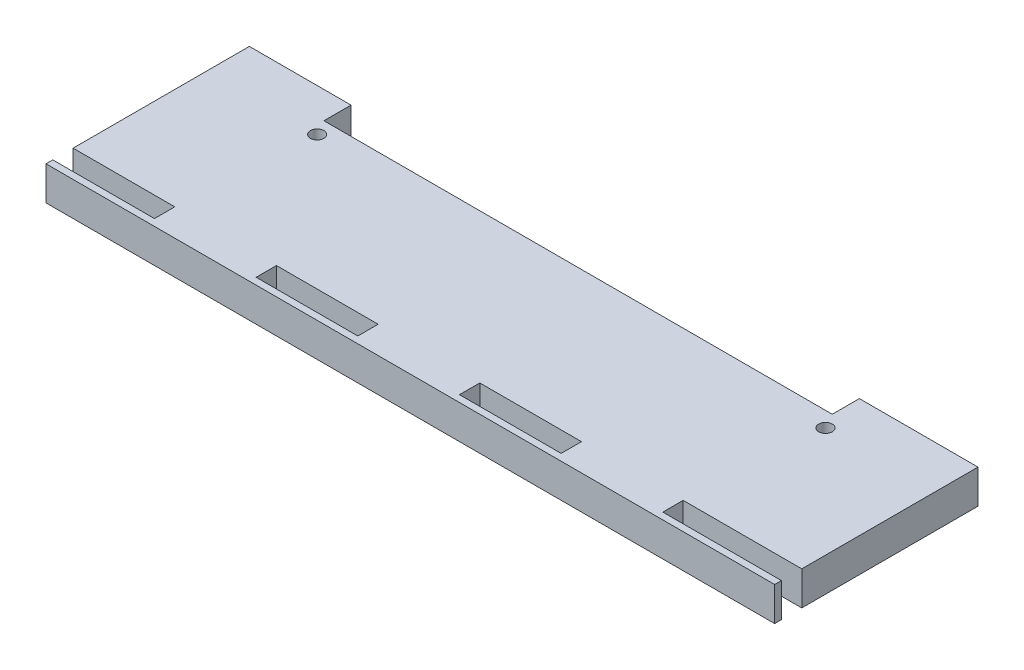
ISO-10303-21;
HEADER;
FILE_DESCRIPTION(('STEP AP214'),'2;1');
FILE_NAME('part.step','',(''),(''),'','','');
FILE_SCHEMA(('AUTOMOTIVE_DESIGN { 1 0 10303 214 1 1 1 1 }'));
ENDSEC;
DATA;
#1=APPLICATION_CONTEXT('core data for automotive mechanical design processes');
#2=APPLICATION_PROTOCOL_DEFINITION('international standard','automotive_design',2000,#1);
#3=PRODUCT_CONTEXT('',#1,'mechanical');
#4=PRODUCT('Part','Part','',(#3));
#5=PRODUCT_RELATED_PRODUCT_CATEGORY('part','',(#4));
#6=PRODUCT_DEFINITION_FORMATION('','',#4);
#7=PRODUCT_DEFINITION_CONTEXT('part definition',#1,'design');
#8=PRODUCT_DEFINITION('design','',#6,#7);
#9=PRODUCT_DEFINITION_SHAPE('','',#8);
#10=(LENGTH_UNIT() NAMED_UNIT(*) SI_UNIT(.MILLI.,.METRE.));
#11=(NAMED_UNIT(*) PLANE_ANGLE_UNIT() SI_UNIT($,.RADIAN.));
#12=(NAMED_UNIT(*) SI_UNIT($,.STERADIAN.) SOLID_ANGLE_UNIT());
#13=UNCERTAINTY_MEASURE_WITH_UNIT(LENGTH_MEASURE(1.E-05),#10,'distance_accuracy_value','');
#14=(GEOMETRIC_REPRESENTATION_CONTEXT(3) GLOBAL_UNCERTAINTY_ASSIGNED_CONTEXT((#13)) GLOBAL_UNIT_ASSIGNED_CONTEXT((#10,
#11,#12)) REPRESENTATION_CONTEXT('',''));
#15=CARTESIAN_POINT('',(0.,0.,0.));
#16=DIRECTION('',(0.,0.,1.));
#17=DIRECTION('',(1.,0.,0.));
#18=AXIS2_PLACEMENT_3D('',#15,#16,#17);
#19=CARTESIAN_POINT('',(0.,10.,33.));
#20=DIRECTION('',(0.,0.,-1.));
#21=DIRECTION('',(-1.,0.,0.));
#22=AXIS2_PLACEMENT_3D('',#19,#20,#21);
#23=PLANE('',#22);
#24=DIRECTION('',(1.,0.,0.));
#25=VECTOR('',#24,1.);
#26=CARTESIAN_POINT('',(0.,0.,33.));
#27=LINE('',#26,#25);
#28=CARTESIAN_POINT('',(72.5,0.,33.));
#29=VERTEX_POINT('',#28);
#30=CARTESIAN_POINT('',(107.5,0.,33.));
#31=VERTEX_POINT('',#30);
#32=EDGE_CURVE('E309',#29,#31,#27,.T.);
#33=ORIENTED_EDGE('',*,*,#32,.F.);
#34=DIRECTION('',(0.,-1.,0.));
#35=VECTOR('',#34,1.);
#36=CARTESIAN_POINT('',(72.5,10.,33.));
#37=LINE('',#36,#35);
#38=CARTESIAN_POINT('',(72.5,10.,33.));
#39=VERTEX_POINT('',#38);
#40=EDGE_CURVE('E11',#39,#29,#37,.T.);
#41=ORIENTED_EDGE('',*,*,#40,.F.);
#42=DIRECTION('',(1.,0.,0.));
#43=VECTOR('',#42,1.);
#44=CARTESIAN_POINT('',(0.,10.,33.));
#45=LINE('',#44,#43);
#46=CARTESIAN_POINT('',(107.5,10.,33.));
#47=VERTEX_POINT('',#46);
#48=EDGE_CURVE('E381',#39,#47,#45,.T.);
#49=ORIENTED_EDGE('',*,*,#48,.T.);
#50=DIRECTION('',(0.,-1.,0.));
#51=VECTOR('',#50,1.);
#52=CARTESIAN_POINT('',(107.5,10.,33.));
#53=LINE('',#52,#51);
#54=EDGE_CURVE('E54',#47,#31,#53,.T.);
#55=ORIENTED_EDGE('',*,*,#54,.T.);
#56=EDGE_LOOP('',(#33,#41,#49,#55));
#57=FACE_BOUND('',#56,.T.);
#58=ADVANCED_FACE('F35',(#57),#23,.T.);
#59=CARTESIAN_POINT('',(72.5,10.,0.));
#60=DIRECTION('',(1.,0.,0.));
#61=DIRECTION('',(0.,0.,-1.));
#62=AXIS2_PLACEMENT_3D('',#59,#60,#61);
#63=PLANE('',#62);
#64=DIRECTION('',(0.,0.,1.));
#65=VECTOR('',#64,1.);
#66=CARTESIAN_POINT('',(72.5,0.,0.));
#67=LINE('',#66,#65);
#68=CARTESIAN_POINT('',(72.5,0.,27.));
#69=VERTEX_POINT('',#68);
#70=EDGE_CURVE('E311',#69,#29,#67,.T.);
#71=ORIENTED_EDGE('',*,*,#70,.F.);
#72=DIRECTION('',(0.,-1.,0.));
#73=VECTOR('',#72,1.);
#74=CARTESIAN_POINT('',(72.5,10.,27.));
#75=LINE('',#74,#73);
#76=CARTESIAN_POINT('',(72.5,10.,27.));
#77=VERTEX_POINT('',#76);
#78=EDGE_CURVE('E45',#77,#69,#75,.T.);
#79=ORIENTED_EDGE('',*,*,#78,.F.);
#80=DIRECTION('',(0.,0.,1.));
#81=VECTOR('',#80,1.);
#82=CARTESIAN_POINT('',(72.5,10.,0.));
#83=LINE('',#82,#81);
#84=EDGE_CURVE('E383',#77,#39,#83,.T.);
#85=ORIENTED_EDGE('',*,*,#84,.T.);
#86=ORIENTED_EDGE('',*,*,#40,.T.);
#87=EDGE_LOOP('',(#71,#79,#85,#86));
#88=FACE_BOUND('',#87,.T.);
#89=ADVANCED_FACE('F438',(#88),#63,.T.);
#90=CARTESIAN_POINT('',(0.,10.,27.));
#91=DIRECTION('',(0.,0.,-1.));
#92=DIRECTION('',(-1.,0.,0.));
#93=AXIS2_PLACEMENT_3D('',#90,#91,#92);
#94=PLANE('',#93);
#95=DIRECTION('',(1.,0.,0.));
#96=VECTOR('',#95,1.);
#97=CARTESIAN_POINT('',(0.,0.,27.));
#98=LINE('',#97,#96);
#99=CARTESIAN_POINT('',(107.5,0.,27.));
#100=VERTEX_POINT('',#99);
#101=EDGE_CURVE('E314',#69,#100,#98,.T.);
#102=ORIENTED_EDGE('',*,*,#101,.T.);
#103=DIRECTION('',(0.,-1.,0.));
#104=VECTOR('',#103,1.);
#105=CARTESIAN_POINT('',(107.5,10.,27.));
#106=LINE('',#105,#104);
#107=CARTESIAN_POINT('',(107.5,10.,27.));
#108=VERTEX_POINT('',#107);
#109=EDGE_CURVE('E252',#108,#100,#106,.T.);
#110=ORIENTED_EDGE('',*,*,#109,.F.);
#111=DIRECTION('',(1.,0.,0.));
#112=VECTOR('',#111,1.);
#113=CARTESIAN_POINT('',(0.,10.,27.));
#114=LINE('',#113,#112);
#115=EDGE_CURVE('E386',#77,#108,#114,.T.);
#116=ORIENTED_EDGE('',*,*,#115,.F.);
#117=ORIENTED_EDGE('',*,*,#78,.T.);
#118=EDGE_LOOP('',(#102,#110,#116,#117));
#119=FACE_BOUND('',#118,.T.);
#120=ADVANCED_FACE('F443',(#119),#94,.F.);
#121=CARTESIAN_POINT('',(107.5,10.,0.));
#122=DIRECTION('',(1.,0.,0.));
#123=DIRECTION('',(0.,0.,-1.));
#124=AXIS2_PLACEMENT_3D('',#121,#122,#123);
#125=PLANE('',#124);
#126=DIRECTION('',(0.,0.,1.));
#127=VECTOR('',#126,1.);
#128=CARTESIAN_POINT('',(107.5,0.,0.));
#129=LINE('',#128,#127);
#130=CARTESIAN_POINT('',(107.5,0.,-25.));
#131=VERTEX_POINT('',#130);
#132=EDGE_CURVE('E317',#131,#100,#129,.T.);
#133=ORIENTED_EDGE('',*,*,#132,.F.);
#134=DIRECTION('',(0.,-1.,0.));
#135=VECTOR('',#134,1.);
#136=CARTESIAN_POINT('',(107.5,10.,-25.));
#137=LINE('',#136,#135);
#138=CARTESIAN_POINT('',(107.5,10.,-25.));
#139=VERTEX_POINT('',#138);
#140=EDGE_CURVE('E250',#139,#131,#137,.T.);
#141=ORIENTED_EDGE('',*,*,#140,.F.);
#142=DIRECTION('',(0.,0.,1.));
#143=VECTOR('',#142,1.);
#144=CARTESIAN_POINT('',(107.5,10.,0.));
#145=LINE('',#144,#143);
#146=EDGE_CURVE('E388',#139,#108,#145,.T.);
#147=ORIENTED_EDGE('',*,*,#146,.T.);
#148=ORIENTED_EDGE('',*,*,#109,.T.);
#149=EDGE_LOOP('',(#133,#141,#147,#148));
#150=FACE_BOUND('',#149,.T.);
#151=ADVANCED_FACE('F568',(#150),#125,.T.);
#152=CARTESIAN_POINT('',(0.,10.,-25.));
#153=DIRECTION('',(0.,0.,-1.));
#154=DIRECTION('',(-1.,0.,0.));
#155=AXIS2_PLACEMENT_3D('',#152,#153,#154);
#156=PLANE('',#155);
#157=DIRECTION('',(1.,0.,0.));
#158=VECTOR('',#157,1.);
#159=CARTESIAN_POINT('',(0.,0.,-25.));
#160=LINE('',#159,#158);
#161=CARTESIAN_POINT('',(72.5,0.,-25.));
#162=VERTEX_POINT('',#161);
#163=EDGE_CURVE('E320',#162,#131,#160,.T.);
#164=ORIENTED_EDGE('',*,*,#163,.F.);
#165=DIRECTION('',(0.,-1.,0.));
#166=VECTOR('',#165,1.);
#167=CARTESIAN_POINT('',(72.5,10.,-25.));
#168=LINE('',#167,#166);
#169=CARTESIAN_POINT('',(72.5,10.,-25.));
#170=VERTEX_POINT('',#169);
#171=EDGE_CURVE('E248',#170,#162,#168,.T.);
#172=ORIENTED_EDGE('',*,*,#171,.F.);
#173=DIRECTION('',(1.,0.,0.));
#174=VECTOR('',#173,1.);
#175=CARTESIAN_POINT('',(0.,10.,-25.));
#176=LINE('',#175,#174);
#177=EDGE_CURVE('E391',#170,#139,#176,.T.);
#178=ORIENTED_EDGE('',*,*,#177,.T.);
#179=ORIENTED_EDGE('',*,*,#140,.T.);
#180=EDGE_LOOP('',(#164,#172,#178,#179));
#181=FACE_BOUND('',#180,.T.);
#182=ADVANCED_FACE('F560',(#181),#156,.T.);
#183=CARTESIAN_POINT('',(72.4999999999999,10.,1.25767452008318E-13));
#184=DIRECTION('',(1.,0.,0.));
#185=DIRECTION('',(0.,0.,-1.));
#186=AXIS2_PLACEMENT_3D('',#183,#184,#185);
#187=PLANE('',#186);
#188=DIRECTION('',(0.,0.,1.));
#189=VECTOR('',#188,1.);
#190=CARTESIAN_POINT('',(72.4999999999999,0.,1.25767452008318E-13));
#191=LINE('',#190,#189);
#192=CARTESIAN_POINT('',(72.5,0.,-17.));
#193=VERTEX_POINT('',#192);
#194=EDGE_CURVE('E323',#162,#193,#191,.T.);
#195=ORIENTED_EDGE('',*,*,#194,.T.);
#196=DIRECTION('',(0.,-1.,0.));
#197=VECTOR('',#196,1.);
#198=CARTESIAN_POINT('',(72.5,10.,-17.));
#199=LINE('',#198,#197);
#200=CARTESIAN_POINT('',(72.5,10.,-17.));
#201=VERTEX_POINT('',#200);
#202=EDGE_CURVE('E246',#201,#193,#199,.T.);
#203=ORIENTED_EDGE('',*,*,#202,.F.);
#204=DIRECTION('',(0.,0.,1.));
#205=VECTOR('',#204,1.);
#206=CARTESIAN_POINT('',(72.4999999999999,10.,1.25767452008318E-13));
#207=LINE('',#206,#205);
#208=EDGE_CURVE('E394',#170,#201,#207,.T.);
#209=ORIENTED_EDGE('',*,*,#208,.F.);
#210=ORIENTED_EDGE('',*,*,#171,.T.);
#211=EDGE_LOOP('',(#195,#203,#209,#210));
#212=FACE_BOUND('',#211,.T.);
#213=ADVANCED_FACE('F552',(#212),#187,.F.);
#214=CARTESIAN_POINT('',(0.,10.,-17.));
#215=DIRECTION('',(0.,0.,-1.));
#216=DIRECTION('',(-1.,0.,0.));
#217=AXIS2_PLACEMENT_3D('',#214,#215,#216);
#218=PLANE('',#217);
#219=DIRECTION('',(1.,0.,0.));
#220=VECTOR('',#219,1.);
#221=CARTESIAN_POINT('',(0.,0.,-17.));
#222=LINE('',#221,#220);
#223=CARTESIAN_POINT('',(-77.5,0.,-17.));
#224=VERTEX_POINT('',#223);
#225=EDGE_CURVE('E326',#224,#193,#222,.T.);
#226=ORIENTED_EDGE('',*,*,#225,.F.);
#227=DIRECTION('',(0.,-1.,0.));
#228=VECTOR('',#227,1.);
#229=CARTESIAN_POINT('',(-77.5,10.,-17.));
#230=LINE('',#229,#228);
#231=CARTESIAN_POINT('',(-77.5,10.,-17.));
#232=VERTEX_POINT('',#231);
#233=EDGE_CURVE('E244',#232,#224,#230,.T.);
#234=ORIENTED_EDGE('',*,*,#233,.F.);
#235=DIRECTION('',(1.,0.,0.));
#236=VECTOR('',#235,1.);
#237=CARTESIAN_POINT('',(0.,10.,-17.));
#238=LINE('',#237,#236);
#239=EDGE_CURVE('E396',#232,#201,#238,.T.);
#240=ORIENTED_EDGE('',*,*,#239,.T.);
#241=ORIENTED_EDGE('',*,*,#202,.T.);
#242=EDGE_LOOP('',(#226,#234,#240,#241));
#243=FACE_BOUND('',#242,.T.);
#244=ADVANCED_FACE('F544',(#243),#218,.T.);
#245=CARTESIAN_POINT('',(-77.5,10.,1.34441069388202E-13));
#246=DIRECTION('',(1.,0.,0.));
#247=DIRECTION('',(0.,0.,-1.));
#248=AXIS2_PLACEMENT_3D('',#245,#246,#247);
#249=PLANE('',#248);
#250=DIRECTION('',(0.,0.,1.));
#251=VECTOR('',#250,1.);
#252=CARTESIAN_POINT('',(-77.5,0.,1.34441069388202E-13));
#253=LINE('',#252,#251);
#254=CARTESIAN_POINT('',(-77.5,0.,-25.));
#255=VERTEX_POINT('',#254);
#256=EDGE_CURVE('E329',#255,#224,#253,.T.);
#257=ORIENTED_EDGE('',*,*,#256,.F.);
#258=DIRECTION('',(0.,-1.,0.));
#259=VECTOR('',#258,1.);
#260=CARTESIAN_POINT('',(-77.5,10.,-25.));
#261=LINE('',#260,#259);
#262=CARTESIAN_POINT('',(-77.5,10.,-25.));
#263=VERTEX_POINT('',#262);
#264=EDGE_CURVE('E242',#263,#255,#261,.T.);
#265=ORIENTED_EDGE('',*,*,#264,.F.);
#266=DIRECTION('',(0.,0.,1.));
#267=VECTOR('',#266,1.);
#268=CARTESIAN_POINT('',(-77.5,10.,1.34441069388202E-13));
#269=LINE('',#268,#267);
#270=EDGE_CURVE('E399',#263,#232,#269,.T.);
#271=ORIENTED_EDGE('',*,*,#270,.T.);
#272=ORIENTED_EDGE('',*,*,#233,.T.);
#273=EDGE_LOOP('',(#257,#265,#271,#272));
#274=FACE_BOUND('',#273,.T.);
#275=ADVANCED_FACE('F536',(#274),#249,.T.);
#276=CARTESIAN_POINT('',(0.,10.,-25.));
#277=DIRECTION('',(0.,0.,-1.));
#278=DIRECTION('',(-1.,0.,0.));
#279=AXIS2_PLACEMENT_3D('',#276,#277,#278);
#280=PLANE('',#279);
#281=DIRECTION('',(1.,0.,0.));
#282=VECTOR('',#281,1.);
#283=CARTESIAN_POINT('',(0.,0.,-25.));
#284=LINE('',#283,#282);
#285=CARTESIAN_POINT('',(-107.5,0.,-25.));
#286=VERTEX_POINT('',#285);
#287=EDGE_CURVE('E332',#286,#255,#284,.T.);
#288=ORIENTED_EDGE('',*,*,#287,.F.);
#289=DIRECTION('',(0.,-1.,0.));
#290=VECTOR('',#289,1.);
#291=CARTESIAN_POINT('',(-107.5,10.,-25.));
#292=LINE('',#291,#290);
#293=CARTESIAN_POINT('',(-107.5,10.,-25.));
#294=VERTEX_POINT('',#293);
#295=EDGE_CURVE('E240',#294,#286,#292,.T.);
#296=ORIENTED_EDGE('',*,*,#295,.F.);
#297=DIRECTION('',(1.,0.,0.));
#298=VECTOR('',#297,1.);
#299=CARTESIAN_POINT('',(0.,10.,-25.));
#300=LINE('',#299,#298);
#301=EDGE_CURVE('E402',#294,#263,#300,.T.);
#302=ORIENTED_EDGE('',*,*,#301,.T.);
#303=ORIENTED_EDGE('',*,*,#264,.T.);
#304=EDGE_LOOP('',(#288,#296,#302,#303));
#305=FACE_BOUND('',#304,.T.);
#306=ADVANCED_FACE('F528',(#305),#280,.T.);
#307=CARTESIAN_POINT('',(-107.5,10.,0.));
#308=DIRECTION('',(1.,0.,0.));
#309=DIRECTION('',(0.,0.,-1.));
#310=AXIS2_PLACEMENT_3D('',#307,#308,#309);
#311=PLANE('',#310);
#312=DIRECTION('',(0.,0.,1.));
#313=VECTOR('',#312,1.);
#314=CARTESIAN_POINT('',(-107.5,0.,0.));
#315=LINE('',#314,#313);
#316=CARTESIAN_POINT('',(-107.5,0.,27.));
#317=VERTEX_POINT('',#316);
#318=EDGE_CURVE('E335',#286,#317,#315,.T.);
#319=ORIENTED_EDGE('',*,*,#318,.T.);
#320=DIRECTION('',(0.,-1.,0.));
#321=VECTOR('',#320,1.);
#322=CARTESIAN_POINT('',(-107.5,10.,27.));
#323=LINE('',#322,#321);
#324=CARTESIAN_POINT('',(-107.5,10.,27.));
#325=VERTEX_POINT('',#324);
#326=EDGE_CURVE('E237',#325,#317,#323,.T.);
#327=ORIENTED_EDGE('',*,*,#326,.F.);
#328=DIRECTION('',(0.,0.,1.));
#329=VECTOR('',#328,1.);
#330=CARTESIAN_POINT('',(-107.5,10.,0.));
#331=LINE('',#330,#329);
#332=EDGE_CURVE('E405',#294,#325,#331,.T.);
#333=ORIENTED_EDGE('',*,*,#332,.F.);
#334=ORIENTED_EDGE('',*,*,#295,.T.);
#335=EDGE_LOOP('',(#319,#327,#333,#334));
#336=FACE_BOUND('',#335,.T.);
#337=ADVANCED_FACE('F520',(#336),#311,.F.);
#338=CARTESIAN_POINT('',(0.,10.,27.));
#339=DIRECTION('',(0.,0.,-1.));
#340=DIRECTION('',(-1.,0.,0.));
#341=AXIS2_PLACEMENT_3D('',#338,#339,#340);
#342=PLANE('',#341);
#343=DIRECTION('',(1.,0.,0.));
#344=VECTOR('',#343,1.);
#345=CARTESIAN_POINT('',(0.,0.,27.));
#346=LINE('',#345,#344);
#347=CARTESIAN_POINT('',(-77.5,0.,27.));
#348=VERTEX_POINT('',#347);
#349=EDGE_CURVE('E338',#317,#348,#346,.T.);
#350=ORIENTED_EDGE('',*,*,#349,.T.);
#351=DIRECTION('',(0.,-1.,0.));
#352=VECTOR('',#351,1.);
#353=CARTESIAN_POINT('',(-77.5,10.,27.));
#354=LINE('',#353,#352);
#355=CARTESIAN_POINT('',(-77.5,10.,27.));
#356=VERTEX_POINT('',#355);
#357=EDGE_CURVE('E234',#356,#348,#354,.T.);
#358=ORIENTED_EDGE('',*,*,#357,.F.);
#359=DIRECTION('',(1.,0.,0.));
#360=VECTOR('',#359,1.);
#361=CARTESIAN_POINT('',(0.,10.,27.));
#362=LINE('',#361,#360);
#363=EDGE_CURVE('E408',#325,#356,#362,.T.);
#364=ORIENTED_EDGE('',*,*,#363,.F.);
#365=ORIENTED_EDGE('',*,*,#326,.T.);
#366=EDGE_LOOP('',(#350,#358,#364,#365));
#367=FACE_BOUND('',#366,.T.);
#368=ADVANCED_FACE('F512',(#367),#342,.F.);
#369=CARTESIAN_POINT('',(-77.4999999999999,10.,-3.5850951836854E-13));
#370=DIRECTION('',(1.,0.,0.));
#371=DIRECTION('',(0.,0.,-1.));
#372=AXIS2_PLACEMENT_3D('',#369,#370,#371);
#373=PLANE('',#372);
#374=DIRECTION('',(0.,0.,1.));
#375=VECTOR('',#374,1.);
#376=CARTESIAN_POINT('',(-77.4999999999999,0.,-3.5850951836854E-13));
#377=LINE('',#376,#375);
#378=CARTESIAN_POINT('',(-77.5,0.,33.));
#379=VERTEX_POINT('',#378);
#380=EDGE_CURVE('E341',#348,#379,#377,.T.);
#381=ORIENTED_EDGE('',*,*,#380,.T.);
#382=DIRECTION('',(0.,-1.,0.));
#383=VECTOR('',#382,1.);
#384=CARTESIAN_POINT('',(-77.5,10.,33.));
#385=LINE('',#384,#383);
#386=CARTESIAN_POINT('',(-77.5,10.,33.));
#387=VERTEX_POINT('',#386);
#388=EDGE_CURVE('E228',#387,#379,#385,.T.);
#389=ORIENTED_EDGE('',*,*,#388,.F.);
#390=DIRECTION('',(0.,0.,1.));
#391=VECTOR('',#390,1.);
#392=CARTESIAN_POINT('',(-77.4999999999999,10.,-3.5850951836854E-13));
#393=LINE('',#392,#391);
#394=EDGE_CURVE('E411',#356,#387,#393,.T.);
#395=ORIENTED_EDGE('',*,*,#394,.F.);
#396=ORIENTED_EDGE('',*,*,#357,.T.);
#397=EDGE_LOOP('',(#381,#389,#395,#396));
#398=FACE_BOUND('',#397,.T.);
#399=ADVANCED_FACE('F504',(#398),#373,.F.);
#400=CARTESIAN_POINT('',(0.,10.,33.));
#401=DIRECTION('',(0.,0.,-1.));
#402=DIRECTION('',(-1.,0.,0.));
#403=AXIS2_PLACEMENT_3D('',#400,#401,#402);
#404=PLANE('',#403);
#405=DIRECTION('',(1.,0.,0.));
#406=VECTOR('',#405,1.);
#407=CARTESIAN_POINT('',(0.,0.,33.));
#408=LINE('',#407,#406);
#409=CARTESIAN_POINT('',(-107.5,0.,33.));
#410=VERTEX_POINT('',#409);
#411=EDGE_CURVE('E344',#410,#379,#408,.T.);
#412=ORIENTED_EDGE('',*,*,#411,.F.);
#413=DIRECTION('',(0.,-1.,0.));
#414=VECTOR('',#413,1.);
#415=CARTESIAN_POINT('',(-107.5,10.,33.));
#416=LINE('',#415,#414);
#417=CARTESIAN_POINT('',(-107.5,10.,33.));
#418=VERTEX_POINT('',#417);
#419=EDGE_CURVE('E226',#418,#410,#416,.T.);
#420=ORIENTED_EDGE('',*,*,#419,.F.);
#421=DIRECTION('',(1.,0.,0.));
#422=VECTOR('',#421,1.);
#423=CARTESIAN_POINT('',(0.,10.,33.));
#424=LINE('',#423,#422);
#425=EDGE_CURVE('E220',#418,#387,#424,.T.);
#426=ORIENTED_EDGE('',*,*,#425,.T.);
#427=ORIENTED_EDGE('',*,*,#388,.T.);
#428=EDGE_LOOP('',(#412,#420,#426,#427));
#429=FACE_BOUND('',#428,.T.);
#430=ADVANCED_FACE('F497',(#429),#404,.T.);
#431=CARTESIAN_POINT('',(-107.5,10.,0.));
#432=DIRECTION('',(1.,0.,0.));
#433=DIRECTION('',(0.,0.,-1.));
#434=AXIS2_PLACEMENT_3D('',#431,#432,#433);
#435=PLANE('',#434);
#436=DIRECTION('',(0.,0.,1.));
#437=VECTOR('',#436,1.);
#438=CARTESIAN_POINT('',(-107.5,0.,0.));
#439=LINE('',#438,#437);
#440=CARTESIAN_POINT('',(-107.5,0.,35.));
#441=VERTEX_POINT('',#440);
#442=EDGE_CURVE('E225',#410,#441,#439,.T.);
#443=ORIENTED_EDGE('',*,*,#442,.T.);
#444=DIRECTION('',(0.,-1.,0.));
#445=VECTOR('',#444,1.);
#446=CARTESIAN_POINT('',(-107.5,10.,35.));
#447=LINE('',#446,#445);
#448=CARTESIAN_POINT('',(-107.5,10.,35.));
#449=VERTEX_POINT('',#448);
#450=EDGE_CURVE('E207',#449,#441,#447,.T.);
#451=ORIENTED_EDGE('',*,*,#450,.F.);
#452=DIRECTION('',(0.,0.,1.));
#453=VECTOR('',#452,1.);
#454=CARTESIAN_POINT('',(-107.5,10.,0.));
#455=LINE('',#454,#453);
#456=EDGE_CURVE('E212',#418,#449,#455,.T.);
#457=ORIENTED_EDGE('',*,*,#456,.F.);
#458=ORIENTED_EDGE('',*,*,#419,.T.);
#459=EDGE_LOOP('',(#443,#451,#457,#458));
#460=FACE_BOUND('',#459,.T.);
#461=ADVANCED_FACE('F223',(#460),#435,.F.);
#462=CARTESIAN_POINT('',(0.,10.,35.));
#463=DIRECTION('',(0.,0.,-1.));
#464=DIRECTION('',(-1.,0.,0.));
#465=AXIS2_PLACEMENT_3D('',#462,#463,#464);
#466=PLANE('',#465);
#467=DIRECTION('',(1.,0.,0.));
#468=VECTOR('',#467,1.);
#469=CARTESIAN_POINT('',(0.,0.,35.));
#470=LINE('',#469,#468);
#471=CARTESIAN_POINT('',(107.5,0.,35.));
#472=VERTEX_POINT('',#471);
#473=EDGE_CURVE('E348',#441,#472,#470,.T.);
#474=ORIENTED_EDGE('',*,*,#473,.T.);
#475=DIRECTION('',(0.,-1.,0.));
#476=VECTOR('',#475,1.);
#477=CARTESIAN_POINT('',(107.5,10.,35.));
#478=LINE('',#477,#476);
#479=CARTESIAN_POINT('',(107.5,10.,35.));
#480=VERTEX_POINT('',#479);
#481=EDGE_CURVE('E128',#480,#472,#478,.T.);
#482=ORIENTED_EDGE('',*,*,#481,.F.);
#483=DIRECTION('',(1.,0.,0.));
#484=VECTOR('',#483,1.);
#485=CARTESIAN_POINT('',(0.,10.,35.));
#486=LINE('',#485,#484);
#487=EDGE_CURVE('E203',#449,#480,#486,.T.);
#488=ORIENTED_EDGE('',*,*,#487,.F.);
#489=ORIENTED_EDGE('',*,*,#450,.T.);
#490=EDGE_LOOP('',(#474,#482,#488,#489));
#491=FACE_BOUND('',#490,.T.);
#492=ADVANCED_FACE('F205',(#491),#466,.F.);
#493=CARTESIAN_POINT('',(0.,10.,27.));
#494=DIRECTION('',(0.,0.,-1.));
#495=DIRECTION('',(-1.,0.,0.));
#496=AXIS2_PLACEMENT_3D('',#493,#494,#495);
#497=PLANE('',#496);
#498=DIRECTION('',(1.,0.,0.));
#499=VECTOR('',#498,1.);
#500=CARTESIAN_POINT('',(0.,0.,27.));
#501=LINE('',#500,#499);
#502=CARTESIAN_POINT('',(12.5,0.,27.));
#503=VERTEX_POINT('',#502);
#504=CARTESIAN_POINT('',(42.5,0.,27.));
#505=VERTEX_POINT('',#504);
#506=EDGE_CURVE('E297',#503,#505,#501,.T.);
#507=ORIENTED_EDGE('',*,*,#506,.T.);
#508=DIRECTION('',(0.,-1.,0.));
#509=VECTOR('',#508,1.);
#510=CARTESIAN_POINT('',(42.5,10.,27.));
#511=LINE('',#510,#509);
#512=CARTESIAN_POINT('',(42.5,10.,27.));
#513=VERTEX_POINT('',#512);
#514=EDGE_CURVE('E261',#513,#505,#511,.T.);
#515=ORIENTED_EDGE('',*,*,#514,.F.);
#516=DIRECTION('',(1.,0.,0.));
#517=VECTOR('',#516,1.);
#518=CARTESIAN_POINT('',(0.,10.,27.));
#519=LINE('',#518,#517);
#520=CARTESIAN_POINT('',(12.5,10.,27.));
#521=VERTEX_POINT('',#520);
#522=EDGE_CURVE('E370',#521,#513,#519,.T.);
#523=ORIENTED_EDGE('',*,*,#522,.F.);
#524=DIRECTION('',(0.,-1.,0.));
#525=VECTOR('',#524,1.);
#526=CARTESIAN_POINT('',(12.5,10.,27.));
#527=LINE('',#526,#525);
#528=EDGE_CURVE('E255',#521,#503,#527,.T.);
#529=ORIENTED_EDGE('',*,*,#528,.T.);
#530=EDGE_LOOP('',(#507,#515,#523,#529));
#531=FACE_BOUND('',#530,.T.);
#532=ADVANCED_FACE('F459',(#531),#497,.F.);
#533=CARTESIAN_POINT('',(42.5000000000001,10.,0.));
#534=DIRECTION('',(1.,0.,0.));
#535=DIRECTION('',(0.,0.,-1.));
#536=AXIS2_PLACEMENT_3D('',#533,#534,#535);
#537=PLANE('',#536);
#538=DIRECTION('',(0.,0.,1.));
#539=VECTOR('',#538,1.);
#540=CARTESIAN_POINT('',(42.5000000000001,0.,0.));
#541=LINE('',#540,#539);
#542=CARTESIAN_POINT('',(42.5,0.,33.));
#543=VERTEX_POINT('',#542);
#544=EDGE_CURVE('E300',#505,#543,#541,.T.);
#545=ORIENTED_EDGE('',*,*,#544,.T.);
#546=DIRECTION('',(0.,-1.,0.));
#547=VECTOR('',#546,1.);
#548=CARTESIAN_POINT('',(42.5,10.,33.));
#549=LINE('',#548,#547);
#550=CARTESIAN_POINT('',(42.5,10.,33.));
#551=VERTEX_POINT('',#550);
#552=EDGE_CURVE('E259',#551,#543,#549,.T.);
#553=ORIENTED_EDGE('',*,*,#552,.F.);
#554=DIRECTION('',(0.,0.,1.));
#555=VECTOR('',#554,1.);
#556=CARTESIAN_POINT('',(42.5000000000001,10.,0.));
#557=LINE('',#556,#555);
#558=EDGE_CURVE('E373',#513,#551,#557,.T.);
#559=ORIENTED_EDGE('',*,*,#558,.F.);
#560=ORIENTED_EDGE('',*,*,#514,.T.);
#561=EDGE_LOOP('',(#545,#553,#559,#560));
#562=FACE_BOUND('',#561,.T.);
#563=ADVANCED_FACE('F455',(#562),#537,.F.);
#564=CARTESIAN_POINT('',(0.,10.,33.));
#565=DIRECTION('',(0.,0.,-1.));
#566=DIRECTION('',(-1.,0.,0.));
#567=AXIS2_PLACEMENT_3D('',#564,#565,#566);
#568=PLANE('',#567);
#569=DIRECTION('',(1.,0.,0.));
#570=VECTOR('',#569,1.);
#571=CARTESIAN_POINT('',(0.,0.,33.));
#572=LINE('',#571,#570);
#573=CARTESIAN_POINT('',(12.5,0.,33.));
#574=VERTEX_POINT('',#573);
#575=EDGE_CURVE('E303',#574,#543,#572,.T.);
#576=ORIENTED_EDGE('',*,*,#575,.F.);
#577=DIRECTION('',(0.,-1.,0.));
#578=VECTOR('',#577,1.);
#579=CARTESIAN_POINT('',(12.5,10.,33.));
#580=LINE('',#579,#578);
#581=CARTESIAN_POINT('',(12.5,10.,33.));
#582=VERTEX_POINT('',#581);
#583=EDGE_CURVE('E257',#582,#574,#580,.T.);
#584=ORIENTED_EDGE('',*,*,#583,.F.);
#585=DIRECTION('',(1.,0.,0.));
#586=VECTOR('',#585,1.);
#587=CARTESIAN_POINT('',(0.,10.,33.));
#588=LINE('',#587,#586);
#589=EDGE_CURVE('E375',#582,#551,#588,.T.);
#590=ORIENTED_EDGE('',*,*,#589,.T.);
#591=ORIENTED_EDGE('',*,*,#552,.T.);
#592=EDGE_LOOP('',(#576,#584,#590,#591));
#593=FACE_BOUND('',#592,.T.);
#594=ADVANCED_FACE('F452',(#593),#568,.T.);
#595=CARTESIAN_POINT('',(-47.4999999999999,10.,-1.09865820145198E-13));
#596=DIRECTION('',(1.,0.,0.));
#597=DIRECTION('',(0.,0.,-1.));
#598=AXIS2_PLACEMENT_3D('',#595,#596,#597);
#599=PLANE('',#598);
#600=DIRECTION('',(0.,0.,1.));
#601=VECTOR('',#600,1.);
#602=CARTESIAN_POINT('',(-47.4999999999999,0.,-1.09865820145198E-13));
#603=LINE('',#602,#601);
#604=CARTESIAN_POINT('',(-47.5,0.,27.));
#605=VERTEX_POINT('',#604);
#606=CARTESIAN_POINT('',(-47.5,0.,33.));
#607=VERTEX_POINT('',#606);
#608=EDGE_CURVE('E286',#605,#607,#603,.T.);
#609=ORIENTED_EDGE('',*,*,#608,.F.);
#610=DIRECTION('',(0.,-1.,0.));
#611=VECTOR('',#610,1.);
#612=CARTESIAN_POINT('',(-47.5,10.,27.));
#613=LINE('',#612,#611);
#614=CARTESIAN_POINT('',(-47.5,10.,27.));
#615=VERTEX_POINT('',#614);
#616=EDGE_CURVE('E39',#615,#605,#613,.T.);
#617=ORIENTED_EDGE('',*,*,#616,.F.);
#618=DIRECTION('',(0.,0.,1.));
#619=VECTOR('',#618,1.);
#620=CARTESIAN_POINT('',(-47.4999999999999,10.,-1.09865820145198E-13));
#621=LINE('',#620,#619);
#622=CARTESIAN_POINT('',(-47.5,10.,33.));
#623=VERTEX_POINT('',#622);
#624=EDGE_CURVE('E358',#615,#623,#621,.T.);
#625=ORIENTED_EDGE('',*,*,#624,.T.);
#626=DIRECTION('',(0.,-1.,0.));
#627=VECTOR('',#626,1.);
#628=CARTESIAN_POINT('',(-47.5,10.,33.));
#629=LINE('',#628,#627);
#630=EDGE_CURVE('E264',#623,#607,#629,.T.);
#631=ORIENTED_EDGE('',*,*,#630,.T.);
#632=EDGE_LOOP('',(#609,#617,#625,#631));
#633=FACE_BOUND('',#632,.T.);
#634=ADVANCED_FACE('F37',(#633),#599,.T.);
#635=CARTESIAN_POINT('',(0.,10.,27.));
#636=DIRECTION('',(0.,0.,-1.));
#637=DIRECTION('',(-1.,0.,0.));
#638=AXIS2_PLACEMENT_3D('',#635,#636,#637);
#639=PLANE('',#638);
#640=DIRECTION('',(1.,0.,0.));
#641=VECTOR('',#640,1.);
#642=CARTESIAN_POINT('',(0.,0.,27.));
#643=LINE('',#642,#641);
#644=CARTESIAN_POINT('',(-17.5,0.,27.));
#645=VERTEX_POINT('',#644);
#646=EDGE_CURVE('E278',#605,#645,#643,.T.);
#647=ORIENTED_EDGE('',*,*,#646,.T.);
#648=DIRECTION('',(0.,-1.,0.));
#649=VECTOR('',#648,1.);
#650=CARTESIAN_POINT('',(-17.5,10.,27.));
#651=LINE('',#650,#649);
#652=CARTESIAN_POINT('',(-17.5,10.,27.));
#653=VERTEX_POINT('',#652);
#654=EDGE_CURVE('E268',#653,#645,#651,.T.);
#655=ORIENTED_EDGE('',*,*,#654,.F.);
#656=DIRECTION('',(1.,0.,0.));
#657=VECTOR('',#656,1.);
#658=CARTESIAN_POINT('',(0.,10.,27.));
#659=LINE('',#658,#657);
#660=EDGE_CURVE('E279',#615,#653,#659,.T.);
#661=ORIENTED_EDGE('',*,*,#660,.F.);
#662=ORIENTED_EDGE('',*,*,#616,.T.);
#663=EDGE_LOOP('',(#647,#655,#661,#662));
#664=FACE_BOUND('',#663,.T.);
#665=ADVANCED_FACE('F277',(#664),#639,.F.);
#666=CARTESIAN_POINT('',(-17.5,10.,0.));
#667=DIRECTION('',(1.,0.,0.));
#668=DIRECTION('',(0.,0.,-1.));
#669=AXIS2_PLACEMENT_3D('',#666,#667,#668);
#670=PLANE('',#669);
#671=DIRECTION('',(0.,0.,1.));
#672=VECTOR('',#671,1.);
#673=CARTESIAN_POINT('',(-17.5,0.,0.));
#674=LINE('',#673,#672);
#675=CARTESIAN_POINT('',(-17.5,0.,33.));
#676=VERTEX_POINT('',#675);
#677=EDGE_CURVE('E288',#645,#676,#674,.T.);
#678=ORIENTED_EDGE('',*,*,#677,.T.);
#679=DIRECTION('',(0.,-1.,0.));
#680=VECTOR('',#679,1.);
#681=CARTESIAN_POINT('',(-17.5,10.,33.));
#682=LINE('',#681,#680);
#683=CARTESIAN_POINT('',(-17.5,10.,33.));
#684=VERTEX_POINT('',#683);
#685=EDGE_CURVE('E266',#684,#676,#682,.T.);
#686=ORIENTED_EDGE('',*,*,#685,.F.);
#687=DIRECTION('',(0.,0.,1.));
#688=VECTOR('',#687,1.);
#689=CARTESIAN_POINT('',(-17.5,10.,0.));
#690=LINE('',#689,#688);
#691=EDGE_CURVE('E363',#653,#684,#690,.T.);
#692=ORIENTED_EDGE('',*,*,#691,.F.);
#693=ORIENTED_EDGE('',*,*,#654,.T.);
#694=EDGE_LOOP('',(#678,#686,#692,#693));
#695=FACE_BOUND('',#694,.T.);
#696=ADVANCED_FACE('F464',(#695),#670,.F.);
#697=CARTESIAN_POINT('',(-75.,10.,-12.5));
#698=DIRECTION('',(0.,-1.,0.));
#699=DIRECTION('',(0.,0.,-1.));
#700=AXIS2_PLACEMENT_3D('',#697,#698,#699);
#701=CYLINDRICAL_SURFACE('',#700,2.);
#702=CARTESIAN_POINT('',(-75.,10.,-12.5));
#703=DIRECTION('',(0.,1.,0.));
#704=DIRECTION('',(0.,0.,1.));
#705=AXIS2_PLACEMENT_3D('',#702,#703,#704);
#706=CIRCLE('',#705,2.);
#707=CARTESIAN_POINT('',(-75.,10.,-10.5));
#708=VERTEX_POINT('',#707);
#709=EDGE_CURVE('E414',#708,#708,#706,.T.);
#710=ORIENTED_EDGE('',*,*,#709,.T.);
#711=EDGE_LOOP('',(#710));
#712=FACE_BOUND('',#711,.T.);
#713=CARTESIAN_POINT('',(-75.,0.,-12.5));
#714=DIRECTION('',(0.,1.,0.));
#715=DIRECTION('',(0.,0.,1.));
#716=AXIS2_PLACEMENT_3D('',#713,#714,#715);
#717=CIRCLE('',#716,2.);
#718=CARTESIAN_POINT('',(-75.,0.,-10.5));
#719=VERTEX_POINT('',#718);
#720=EDGE_CURVE('E353',#719,#719,#717,.T.);
#721=ORIENTED_EDGE('',*,*,#720,.F.);
#722=EDGE_LOOP('',(#721));
#723=FACE_BOUND('',#722,.T.);
#724=ADVANCED_FACE('F466',(#712,#723),#701,.F.);
#725=CARTESIAN_POINT('',(107.5,10.,0.));
#726=DIRECTION('',(1.,0.,0.));
#727=DIRECTION('',(0.,0.,-1.));
#728=AXIS2_PLACEMENT_3D('',#725,#726,#727);
#729=PLANE('',#728);
#730=DIRECTION('',(0.,0.,1.));
#731=VECTOR('',#730,1.);
#732=CARTESIAN_POINT('',(107.5,0.,0.));
#733=LINE('',#732,#731);
#734=EDGE_CURVE('E350',#31,#472,#733,.T.);
#735=ORIENTED_EDGE('',*,*,#734,.F.);
#736=ORIENTED_EDGE('',*,*,#54,.F.);
#737=DIRECTION('',(0.,0.,1.));
#738=VECTOR('',#737,1.);
#739=CARTESIAN_POINT('',(107.5,10.,0.));
#740=LINE('',#739,#738);
#741=EDGE_CURVE('E211',#47,#480,#740,.T.);
#742=ORIENTED_EDGE('',*,*,#741,.T.);
#743=ORIENTED_EDGE('',*,*,#481,.T.);
#744=EDGE_LOOP('',(#735,#736,#742,#743));
#745=FACE_BOUND('',#744,.T.);
#746=ADVANCED_FACE('F450',(#745),#729,.T.);
#747=CARTESIAN_POINT('',(12.5000000000001,10.,0.));
#748=DIRECTION('',(1.,0.,0.));
#749=DIRECTION('',(0.,0.,-1.));
#750=AXIS2_PLACEMENT_3D('',#747,#748,#749);
#751=PLANE('',#750);
#752=DIRECTION('',(0.,0.,1.));
#753=VECTOR('',#752,1.);
#754=CARTESIAN_POINT('',(12.5000000000001,0.,0.));
#755=LINE('',#754,#753);
#756=EDGE_CURVE('E306',#503,#574,#755,.T.);
#757=ORIENTED_EDGE('',*,*,#756,.F.);
#758=ORIENTED_EDGE('',*,*,#528,.F.);
#759=DIRECTION('',(0.,0.,1.));
#760=VECTOR('',#759,1.);
#761=CARTESIAN_POINT('',(12.5000000000001,10.,0.));
#762=LINE('',#761,#760);
#763=EDGE_CURVE('E378',#521,#582,#762,.T.);
#764=ORIENTED_EDGE('',*,*,#763,.T.);
#765=ORIENTED_EDGE('',*,*,#583,.T.);
#766=EDGE_LOOP('',(#757,#758,#764,#765));
#767=FACE_BOUND('',#766,.T.);
#768=ADVANCED_FACE('F432',(#767),#751,.T.);
#769=CARTESIAN_POINT('',(0.,10.,33.));
#770=DIRECTION('',(0.,0.,-1.));
#771=DIRECTION('',(-1.,0.,0.));
#772=AXIS2_PLACEMENT_3D('',#769,#770,#771);
#773=PLANE('',#772);
#774=DIRECTION('',(1.,0.,0.));
#775=VECTOR('',#774,1.);
#776=CARTESIAN_POINT('',(0.,0.,33.));
#777=LINE('',#776,#775);
#778=EDGE_CURVE('E295',#607,#676,#777,.T.);
#779=ORIENTED_EDGE('',*,*,#778,.F.);
#780=ORIENTED_EDGE('',*,*,#630,.F.);
#781=DIRECTION('',(1.,0.,0.));
#782=VECTOR('',#781,1.);
#783=CARTESIAN_POINT('',(0.,10.,33.));
#784=LINE('',#783,#782);
#785=EDGE_CURVE('E367',#623,#684,#784,.T.);
#786=ORIENTED_EDGE('',*,*,#785,.T.);
#787=ORIENTED_EDGE('',*,*,#685,.T.);
#788=EDGE_LOOP('',(#779,#780,#786,#787));
#789=FACE_BOUND('',#788,.T.);
#790=ADVANCED_FACE('F424',(#789),#773,.T.);
#791=CARTESIAN_POINT('',(75.,10.,-12.5));
#792=DIRECTION('',(0.,-1.,0.));
#793=DIRECTION('',(0.,0.,-1.));
#794=AXIS2_PLACEMENT_3D('',#791,#792,#793);
#795=CYLINDRICAL_SURFACE('',#794,2.);
#796=CARTESIAN_POINT('',(75.,10.,-12.5));
#797=DIRECTION('',(0.,1.,0.));
#798=DIRECTION('',(0.,0.,1.));
#799=AXIS2_PLACEMENT_3D('',#796,#797,#798);
#800=CIRCLE('',#799,2.);
#801=CARTESIAN_POINT('',(75.,10.,-10.5));
#802=VERTEX_POINT('',#801);
#803=EDGE_CURVE('E267',#802,#802,#800,.F.);
#804=ORIENTED_EDGE('',*,*,#803,.F.);
#805=EDGE_LOOP('',(#804));
#806=FACE_BOUND('',#805,.T.);
#807=CARTESIAN_POINT('',(75.,0.,-12.5));
#808=DIRECTION('',(0.,1.,0.));
#809=DIRECTION('',(0.,0.,1.));
#810=AXIS2_PLACEMENT_3D('',#807,#808,#809);
#811=CIRCLE('',#810,2.);
#812=CARTESIAN_POINT('',(75.,0.,-10.5));
#813=VERTEX_POINT('',#812);
#814=EDGE_CURVE('E356',#813,#813,#811,.F.);
#815=ORIENTED_EDGE('',*,*,#814,.T.);
#816=EDGE_LOOP('',(#815));
#817=FACE_BOUND('',#816,.T.);
#818=ADVANCED_FACE('F422',(#806,#817),#795,.F.);
#819=CARTESIAN_POINT('',(0.,10.,0.));
#820=DIRECTION('',(0.,1.,0.));
#821=DIRECTION('',(0.,0.,1.));
#822=AXIS2_PLACEMENT_3D('',#819,#820,#821);
#823=PLANE('',#822);
#824=ORIENTED_EDGE('',*,*,#624,.F.);
#825=ORIENTED_EDGE('',*,*,#660,.T.);
#826=ORIENTED_EDGE('',*,*,#691,.T.);
#827=ORIENTED_EDGE('',*,*,#785,.F.);
#828=EDGE_LOOP('',(#824,#825,#826,#827));
#829=FACE_BOUND('',#828,.T.);
#830=ORIENTED_EDGE('',*,*,#522,.T.);
#831=ORIENTED_EDGE('',*,*,#558,.T.);
#832=ORIENTED_EDGE('',*,*,#589,.F.);
#833=ORIENTED_EDGE('',*,*,#763,.F.);
#834=EDGE_LOOP('',(#830,#831,#832,#833));
#835=FACE_BOUND('',#834,.T.);
#836=ORIENTED_EDGE('',*,*,#48,.F.);
#837=ORIENTED_EDGE('',*,*,#84,.F.);
#838=ORIENTED_EDGE('',*,*,#115,.T.);
#839=ORIENTED_EDGE('',*,*,#146,.F.);
#840=ORIENTED_EDGE('',*,*,#177,.F.);
#841=ORIENTED_EDGE('',*,*,#208,.T.);
#842=ORIENTED_EDGE('',*,*,#239,.F.);
#843=ORIENTED_EDGE('',*,*,#270,.F.);
#844=ORIENTED_EDGE('',*,*,#301,.F.);
#845=ORIENTED_EDGE('',*,*,#332,.T.);
#846=ORIENTED_EDGE('',*,*,#363,.T.);
#847=ORIENTED_EDGE('',*,*,#394,.T.);
#848=ORIENTED_EDGE('',*,*,#425,.F.);
#849=ORIENTED_EDGE('',*,*,#456,.T.);
#850=ORIENTED_EDGE('',*,*,#487,.T.);
#851=ORIENTED_EDGE('',*,*,#741,.F.);
#852=EDGE_LOOP('',(#836,#837,#838,#839,#840,#841,#842,#843,#844,#845,#846,#847,#848,#849,#850,#851));
#853=FACE_BOUND('',#852,.T.);
#854=ORIENTED_EDGE('',*,*,#709,.F.);
#855=EDGE_LOOP('',(#854));
#856=FACE_BOUND('',#855,.T.);
#857=ORIENTED_EDGE('',*,*,#803,.T.);
#858=EDGE_LOOP('',(#857));
#859=FACE_BOUND('',#858,.T.);
#860=ADVANCED_FACE('F217',(#829,#835,#853,#856,#859),#823,.T.);
#861=CARTESIAN_POINT('',(0.,0.,0.));
#862=DIRECTION('',(0.,1.,0.));
#863=DIRECTION('',(0.,0.,1.));
#864=AXIS2_PLACEMENT_3D('',#861,#862,#863);
#865=PLANE('',#864);
#866=ORIENTED_EDGE('',*,*,#608,.T.);
#867=ORIENTED_EDGE('',*,*,#778,.T.);
#868=ORIENTED_EDGE('',*,*,#677,.F.);
#869=ORIENTED_EDGE('',*,*,#646,.F.);
#870=EDGE_LOOP('',(#866,#867,#868,#869));
#871=FACE_BOUND('',#870,.T.);
#872=ORIENTED_EDGE('',*,*,#506,.F.);
#873=ORIENTED_EDGE('',*,*,#756,.T.);
#874=ORIENTED_EDGE('',*,*,#575,.T.);
#875=ORIENTED_EDGE('',*,*,#544,.F.);
#876=EDGE_LOOP('',(#872,#873,#874,#875));
#877=FACE_BOUND('',#876,.T.);
#878=ORIENTED_EDGE('',*,*,#32,.T.);
#879=ORIENTED_EDGE('',*,*,#734,.T.);
#880=ORIENTED_EDGE('',*,*,#473,.F.);
#881=ORIENTED_EDGE('',*,*,#442,.F.);
#882=ORIENTED_EDGE('',*,*,#411,.T.);
#883=ORIENTED_EDGE('',*,*,#380,.F.);
#884=ORIENTED_EDGE('',*,*,#349,.F.);
#885=ORIENTED_EDGE('',*,*,#318,.F.);
#886=ORIENTED_EDGE('',*,*,#287,.T.);
#887=ORIENTED_EDGE('',*,*,#256,.T.);
#888=ORIENTED_EDGE('',*,*,#225,.T.);
#889=ORIENTED_EDGE('',*,*,#194,.F.);
#890=ORIENTED_EDGE('',*,*,#163,.T.);
#891=ORIENTED_EDGE('',*,*,#132,.T.);
#892=ORIENTED_EDGE('',*,*,#101,.F.);
#893=ORIENTED_EDGE('',*,*,#70,.T.);
#894=EDGE_LOOP('',(#878,#879,#880,#881,#882,#883,#884,#885,#886,#887,#888,#889,#890,#891,#892,#893));
#895=FACE_BOUND('',#894,.T.);
#896=ORIENTED_EDGE('',*,*,#720,.T.);
#897=EDGE_LOOP('',(#896));
#898=FACE_BOUND('',#897,.T.);
#899=ORIENTED_EDGE('',*,*,#814,.F.);
#900=EDGE_LOOP('',(#899));
#901=FACE_BOUND('',#900,.T.);
#902=ADVANCED_FACE('F283',(#871,#877,#895,#898,#901),#865,.F.);
#903=CLOSED_SHELL('',(#58,#89,#120,#151,#182,#213,#244,#275,#306,#337,#368,#399,#430,#461,#492,
#532,#563,#594,#634,#665,#696,#724,#746,#768,#790,#818,#860,#902));
#904=MANIFOLD_SOLID_BREP('B2',#903);
#905=ADVANCED_BREP_SHAPE_REPRESENTATION('',(#18,#904),#14);
#906=SHAPE_DEFINITION_REPRESENTATION(#9,#905);
ENDSEC;
END-ISO-10303-21;
